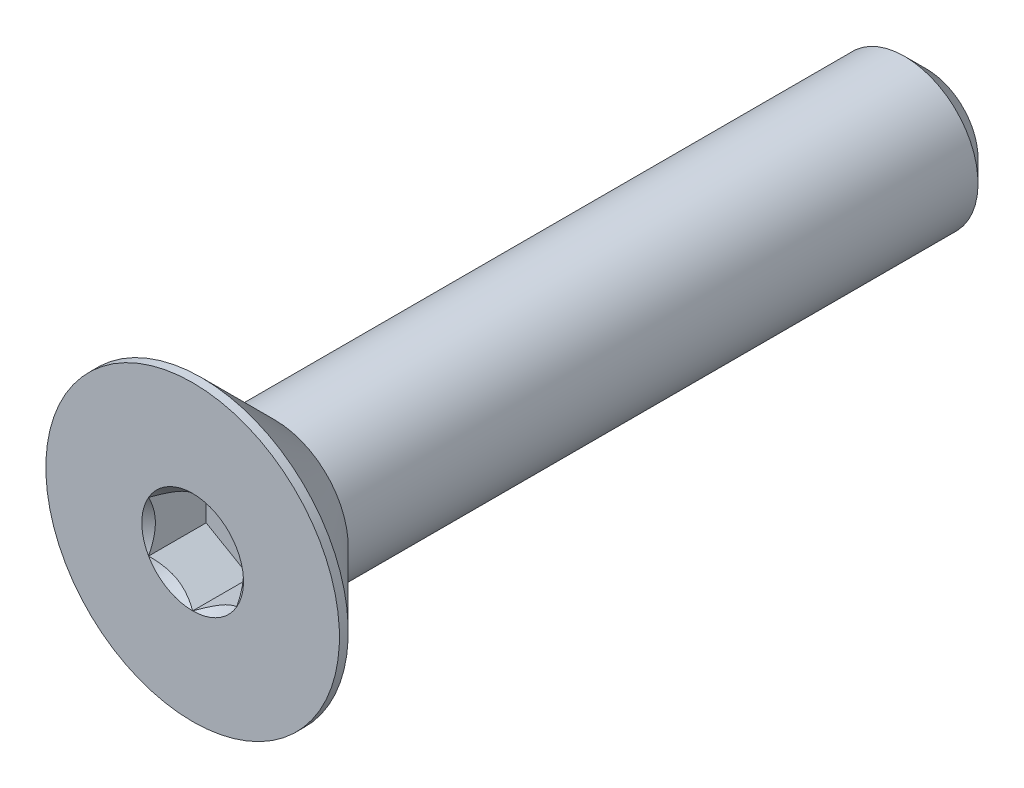
ISO-10303-21;
HEADER;
FILE_DESCRIPTION(('STEP AP214'),'2;1');
FILE_NAME('part.step','',(''),(''),'','','');
FILE_SCHEMA(('AUTOMOTIVE_DESIGN { 1 0 10303 214 1 1 1 1 }'));
ENDSEC;
DATA;
#1=APPLICATION_CONTEXT('core data for automotive mechanical design processes');
#2=APPLICATION_PROTOCOL_DEFINITION('international standard','automotive_design',2000,#1);
#3=PRODUCT_CONTEXT('',#1,'mechanical');
#4=PRODUCT('Part','Part','',(#3));
#5=PRODUCT_RELATED_PRODUCT_CATEGORY('part','',(#4));
#6=PRODUCT_DEFINITION_FORMATION('','',#4);
#7=PRODUCT_DEFINITION_CONTEXT('part definition',#1,'design');
#8=PRODUCT_DEFINITION('design','',#6,#7);
#9=PRODUCT_DEFINITION_SHAPE('','',#8);
#10=(LENGTH_UNIT() NAMED_UNIT(*) SI_UNIT(.MILLI.,.METRE.));
#11=(NAMED_UNIT(*) PLANE_ANGLE_UNIT() SI_UNIT($,.RADIAN.));
#12=(NAMED_UNIT(*) SI_UNIT($,.STERADIAN.) SOLID_ANGLE_UNIT());
#13=UNCERTAINTY_MEASURE_WITH_UNIT(LENGTH_MEASURE(1.E-05),#10,'distance_accuracy_value','');
#14=(GEOMETRIC_REPRESENTATION_CONTEXT(3) GLOBAL_UNCERTAINTY_ASSIGNED_CONTEXT((#13)) GLOBAL_UNIT_ASSIGNED_CONTEXT((#10,
#11,#12)) REPRESENTATION_CONTEXT('',''));
#15=CARTESIAN_POINT('',(0.,0.,0.));
#16=DIRECTION('',(0.,0.,1.));
#17=DIRECTION('',(1.,0.,0.));
#18=AXIS2_PLACEMENT_3D('',#15,#16,#17);
#19=CARTESIAN_POINT('',(0.,0.,-12.5));
#20=DIRECTION('',(0.,0.,-1.));
#21=DIRECTION('',(0.,1.,0.));
#22=AXIS2_PLACEMENT_3D('',#19,#20,#21);
#23=CYLINDRICAL_SURFACE('',#22,2.5);
#24=CARTESIAN_POINT('',(0.,0.,9.7));
#25=DIRECTION('',(0.,0.,-1.));
#26=DIRECTION('',(0.,1.,0.));
#27=AXIS2_PLACEMENT_3D('',#24,#25,#26);
#28=CIRCLE('',#27,2.5);
#29=CARTESIAN_POINT('',(0.,2.5,9.7));
#30=VERTEX_POINT('',#29);
#31=EDGE_CURVE('E11',#30,#30,#28,.F.);
#32=ORIENTED_EDGE('',*,*,#31,.F.);
#33=EDGE_LOOP('',(#32));
#34=FACE_BOUND('',#33,.T.);
#35=CARTESIAN_POINT('',(0.,0.,-11.75));
#36=DIRECTION('',(0.,0.,-1.));
#37=DIRECTION('',(0.,1.,0.));
#38=AXIS2_PLACEMENT_3D('',#35,#36,#37);
#39=CIRCLE('',#38,2.5);
#40=CARTESIAN_POINT('',(0.,2.5,-11.75));
#41=VERTEX_POINT('',#40);
#42=EDGE_CURVE('E48',#41,#41,#39,.F.);
#43=ORIENTED_EDGE('',*,*,#42,.T.);
#44=EDGE_LOOP('',(#43));
#45=FACE_BOUND('',#44,.T.);
#46=ADVANCED_FACE('F39',(#34,#45),#23,.T.);
#47=CARTESIAN_POINT('',(0.,2.5,-12.5));
#48=DIRECTION('',(0.,0.,-1.));
#49=DIRECTION('',(0.,1.,0.));
#50=AXIS2_PLACEMENT_3D('',#47,#48,#49);
#51=PLANE('',#50);
#52=CARTESIAN_POINT('',(0.,0.,-12.5));
#53=DIRECTION('',(0.,0.,-1.));
#54=DIRECTION('',(0.,1.,0.));
#55=AXIS2_PLACEMENT_3D('',#52,#53,#54);
#56=CIRCLE('',#55,1.74999999999999);
#57=CARTESIAN_POINT('',(0.,1.75,-12.5));
#58=VERTEX_POINT('',#57);
#59=EDGE_CURVE('E164',#58,#58,#56,.T.);
#60=ORIENTED_EDGE('',*,*,#59,.T.);
#61=EDGE_LOOP('',(#60));
#62=FACE_BOUND('',#61,.T.);
#63=ADVANCED_FACE('F175',(#62),#51,.T.);
#64=CARTESIAN_POINT('',(0.,0.,-12.5));
#65=DIRECTION('',(0.,0.,1.));
#66=DIRECTION('',(0.,-1.,0.));
#67=AXIS2_PLACEMENT_3D('',#64,#65,#66);
#68=CONICAL_SURFACE('',#67,1.74999999999999,0.785398163397447);
#69=ORIENTED_EDGE('',*,*,#42,.F.);
#70=EDGE_LOOP('',(#69));
#71=FACE_BOUND('',#70,.T.);
#72=ORIENTED_EDGE('',*,*,#59,.F.);
#73=EDGE_LOOP('',(#72));
#74=FACE_BOUND('',#73,.T.);
#75=ADVANCED_FACE('F41',(#71,#74),#68,.T.);
#76=CARTESIAN_POINT('',(0.,0.,-12.5));
#77=DIRECTION('',(0.,0.,-1.));
#78=DIRECTION('',(0.,1.,0.));
#79=AXIS2_PLACEMENT_3D('',#76,#77,#78);
#80=CYLINDRICAL_SURFACE('',#79,5.);
#81=CARTESIAN_POINT('',(0.,0.,12.5));
#82=DIRECTION('',(0.,0.,-1.));
#83=DIRECTION('',(0.,1.,0.));
#84=AXIS2_PLACEMENT_3D('',#81,#82,#83);
#85=CIRCLE('',#84,5.);
#86=CARTESIAN_POINT('',(0.,5.,12.5));
#87=VERTEX_POINT('',#86);
#88=EDGE_CURVE('E139',#87,#87,#85,.T.);
#89=ORIENTED_EDGE('',*,*,#88,.T.);
#90=EDGE_LOOP('',(#89));
#91=FACE_BOUND('',#90,.T.);
#92=CARTESIAN_POINT('',(0.,0.,12.2));
#93=DIRECTION('',(0.,0.,-1.));
#94=DIRECTION('',(0.,1.,0.));
#95=AXIS2_PLACEMENT_3D('',#92,#93,#94);
#96=CIRCLE('',#95,5.);
#97=CARTESIAN_POINT('',(0.,5.,12.2));
#98=VERTEX_POINT('',#97);
#99=EDGE_CURVE('E134',#98,#98,#96,.T.);
#100=ORIENTED_EDGE('',*,*,#99,.F.);
#101=EDGE_LOOP('',(#100));
#102=FACE_BOUND('',#101,.T.);
#103=ADVANCED_FACE('F174',(#91,#102),#80,.T.);
#104=CARTESIAN_POINT('',(0.,0.,9.7));
#105=DIRECTION('',(0.,0.,1.));
#106=DIRECTION('',(0.,-1.,0.));
#107=AXIS2_PLACEMENT_3D('',#104,#105,#106);
#108=CONICAL_SURFACE('',#107,2.5,0.78539816339745);
#109=ORIENTED_EDGE('',*,*,#99,.T.);
#110=EDGE_LOOP('',(#109));
#111=FACE_BOUND('',#110,.T.);
#112=ORIENTED_EDGE('',*,*,#31,.T.);
#113=EDGE_LOOP('',(#112));
#114=FACE_BOUND('',#113,.T.);
#115=ADVANCED_FACE('F188',(#111,#114),#108,.T.);
#116=CARTESIAN_POINT('',(0.,0.,12.5));
#117=DIRECTION('',(0.,0.,1.));
#118=DIRECTION('',(0.,-1.,0.));
#119=AXIS2_PLACEMENT_3D('',#116,#117,#118);
#120=PLANE('',#119);
#121=CARTESIAN_POINT('',(0.,0.,12.5));
#122=DIRECTION('',(0.,0.,1.));
#123=DIRECTION('',(1.,0.,0.));
#124=AXIS2_PLACEMENT_3D('',#121,#122,#123);
#125=CIRCLE('',#124,1.73205080756888);
#126=CARTESIAN_POINT('',(1.5,0.866025403784443,12.5));
#127=VERTEX_POINT('',#126);
#128=CARTESIAN_POINT('',(0.,1.73205080756888,12.5));
#129=VERTEX_POINT('',#128);
#130=EDGE_CURVE('E99',#127,#129,#125,.T.);
#131=ORIENTED_EDGE('',*,*,#130,.F.);
#132=CARTESIAN_POINT('',(0.,0.,12.5));
#133=DIRECTION('',(0.,0.,1.));
#134=DIRECTION('',(1.,0.,0.));
#135=AXIS2_PLACEMENT_3D('',#132,#133,#134);
#136=CIRCLE('',#135,1.73205080756888);
#137=CARTESIAN_POINT('',(1.49999999999999,-0.866025403784446,12.5));
#138=VERTEX_POINT('',#137);
#139=EDGE_CURVE('E112',#138,#127,#136,.T.);
#140=ORIENTED_EDGE('',*,*,#139,.F.);
#141=CARTESIAN_POINT('',(0.,0.,12.5));
#142=DIRECTION('',(0.,0.,1.));
#143=DIRECTION('',(1.,0.,0.));
#144=AXIS2_PLACEMENT_3D('',#141,#142,#143);
#145=CIRCLE('',#144,1.73205080756888);
#146=CARTESIAN_POINT('',(0.,-1.73205080756887,12.5));
#147=VERTEX_POINT('',#146);
#148=EDGE_CURVE('E268',#147,#138,#145,.T.);
#149=ORIENTED_EDGE('',*,*,#148,.F.);
#150=CARTESIAN_POINT('',(0.,0.,12.5));
#151=DIRECTION('',(0.,0.,1.));
#152=DIRECTION('',(1.,0.,0.));
#153=AXIS2_PLACEMENT_3D('',#150,#151,#152);
#154=CIRCLE('',#153,1.73205080756888);
#155=CARTESIAN_POINT('',(-1.5,-0.866025403784427,12.5));
#156=VERTEX_POINT('',#155);
#157=EDGE_CURVE('E128',#156,#147,#154,.T.);
#158=ORIENTED_EDGE('',*,*,#157,.F.);
#159=CARTESIAN_POINT('',(0.,0.,12.5));
#160=DIRECTION('',(0.,0.,1.));
#161=DIRECTION('',(1.,0.,0.));
#162=AXIS2_PLACEMENT_3D('',#159,#160,#161);
#163=CIRCLE('',#162,1.73205080756888);
#164=CARTESIAN_POINT('',(-1.5,0.866025403784438,12.5));
#165=VERTEX_POINT('',#164);
#166=EDGE_CURVE('E269',#165,#156,#163,.T.);
#167=ORIENTED_EDGE('',*,*,#166,.F.);
#168=CARTESIAN_POINT('',(0.,0.,12.5));
#169=DIRECTION('',(0.,0.,1.));
#170=DIRECTION('',(1.,0.,0.));
#171=AXIS2_PLACEMENT_3D('',#168,#169,#170);
#172=CIRCLE('',#171,1.73205080756888);
#173=EDGE_CURVE('E115',#129,#165,#172,.T.);
#174=ORIENTED_EDGE('',*,*,#173,.F.);
#175=EDGE_LOOP('',(#131,#140,#149,#158,#167,#174));
#176=FACE_BOUND('',#175,.T.);
#177=ORIENTED_EDGE('',*,*,#88,.F.);
#178=EDGE_LOOP('',(#177));
#179=FACE_BOUND('',#178,.T.);
#180=ADVANCED_FACE('F109',(#176,#179),#120,.T.);
#181=CARTESIAN_POINT('',(1.5,0.86602540378444,10.54));
#182=DIRECTION('',(0.5,0.866025403784438,0.));
#183=DIRECTION('',(-0.866025403784439,0.5,0.));
#184=AXIS2_PLACEMENT_3D('',#181,#182,#183);
#185=PLANE('',#184);
#186=DIRECTION('',(0.,0.,1.));
#187=VECTOR('',#186,1.);
#188=CARTESIAN_POINT('',(1.5,0.86602540378444,10.54));
#189=LINE('',#188,#187);
#190=CARTESIAN_POINT('',(1.5,0.86602540378444,10.54));
#191=VERTEX_POINT('',#190);
#192=EDGE_CURVE('E55',#191,#127,#189,.T.);
#193=ORIENTED_EDGE('',*,*,#192,.T.);
#194=CARTESIAN_POINT('',(-0.000200000000000019,1.73216627762272,12.5001154816001));
#195=CARTESIAN_POINT('',(0.0513677907370754,1.70239359975915,12.4703654760673));
#196=CARTESIAN_POINT('',(0.1037979176652,1.67212305186355,12.4423624839103));
#197=CARTESIAN_POINT('',(0.210709034055596,1.61039789003619,12.3910892304401));
#198=CARTESIAN_POINT('',(0.26520019581466,1.57893740312614,12.3678475050444));
#199=CARTESIAN_POINT('',(0.375079081357247,1.51549879897987,12.3280337289922));
#200=CARTESIAN_POINT('',(0.430438809095198,1.4835368452681,12.3113615856709));
#201=CARTESIAN_POINT('',(0.542377257477149,1.41890915196211,12.2856744568181));
#202=CARTESIAN_POINT('',(0.598952556553007,1.38624538781118,12.2766402904789));
#203=CARTESIAN_POINT('',(0.696455389516439,1.329952100953,12.2684890812268));
#204=CARTESIAN_POINT('',(0.737256908280464,1.30639533311124,12.2672822529892));
#205=CARTESIAN_POINT('',(0.818787969615856,1.25932335290194,12.2693140571623));
#206=CARTESIAN_POINT('',(0.859517494314628,1.23580815085314,12.2725536707483));
#207=CARTESIAN_POINT('',(0.940584402163413,1.18900414978427,12.283291985982));
#208=CARTESIAN_POINT('',(0.980921384598285,1.1657155821172,12.2907946530187));
#209=CARTESIAN_POINT('',(1.06091833691403,1.11952932016335,12.3096516119283));
#210=CARTESIAN_POINT('',(1.1005780085162,1.09663179808787,12.3210075570186));
#211=CARTESIAN_POINT('',(1.20216313477448,1.03798159809699,12.3547216475927));
#212=CARTESIAN_POINT('',(1.26345855370969,1.00259267147466,12.3796218490934));
#213=CARTESIAN_POINT('',(1.35358562846331,0.950557780604376,12.4216566532716));
#214=CARTESIAN_POINT('',(1.38328513990772,0.933410759677149,12.4364251535591));
#215=CARTESIAN_POINT('',(1.44213790138375,0.899432101996408,12.4673105659402));
#216=CARTESIAN_POINT('',(1.47129140422064,0.882600319285711,12.4834268341217));
#217=CARTESIAN_POINT('',(1.5002,0.865909933730602,12.5001154816001));
#218=B_SPLINE_CURVE_WITH_KNOTS('',3,(#194,#195,#196,#197,#198,#199,#200,#201,#202,#203,#204,
#205,#206,#207,#208,#209,#210,#211,#212,#213,#214,#215,#216,#217),.UNSPECIFIED.,.F.,.F.,(4,2,2,
2,2,2,2,2,2,2,2,4),(0.,0.199829143693304,0.400822987382387,0.598623720538179,0.795926240188887,
0.937113067959879,1.07833105577193,1.21968061668221,1.36109089931054,1.58570969637565,
1.69770705470963,1.80965120737194),.UNSPECIFIED.);
#219=EDGE_CURVE('E96',#129,#127,#218,.T.);
#220=ORIENTED_EDGE('',*,*,#219,.F.);
#221=DIRECTION('',(0.,0.,1.));
#222=VECTOR('',#221,1.);
#223=CARTESIAN_POINT('',(0.,1.73205080756888,10.54));
#224=LINE('',#223,#222);
#225=CARTESIAN_POINT('',(0.,1.73205080756888,10.54));
#226=VERTEX_POINT('',#225);
#227=EDGE_CURVE('E158',#226,#129,#224,.T.);
#228=ORIENTED_EDGE('',*,*,#227,.F.);
#229=DIRECTION('',(-0.866025403784439,0.5,0.));
#230=VECTOR('',#229,1.);
#231=CARTESIAN_POINT('',(1.5,0.86602540378444,10.54));
#232=LINE('',#231,#230);
#233=EDGE_CURVE('E124',#191,#226,#232,.T.);
#234=ORIENTED_EDGE('',*,*,#233,.F.);
#235=EDGE_LOOP('',(#193,#220,#228,#234));
#236=FACE_BOUND('',#235,.T.);
#237=ADVANCED_FACE('F130',(#236),#185,.F.);
#238=CARTESIAN_POINT('',(1.5,-0.86602540378444,10.54));
#239=DIRECTION('',(1.,0.,0.));
#240=DIRECTION('',(0.,0.,-1.));
#241=AXIS2_PLACEMENT_3D('',#238,#239,#240);
#242=PLANE('',#241);
#243=DIRECTION('',(0.,0.,1.));
#244=VECTOR('',#243,1.);
#245=CARTESIAN_POINT('',(1.5,-0.86602540378444,10.54));
#246=LINE('',#245,#244);
#247=CARTESIAN_POINT('',(1.5,-0.86602540378444,10.54));
#248=VERTEX_POINT('',#247);
#249=EDGE_CURVE('E63',#248,#138,#246,.T.);
#250=ORIENTED_EDGE('',*,*,#249,.T.);
#251=CARTESIAN_POINT('',(1.5,-1.72720812969693,13.0555785162708));
#252=CARTESIAN_POINT('',(1.5,-1.68515175699268,13.0238299078574));
#253=CARTESIAN_POINT('',(1.5,-1.64286104748674,12.9923925938074));
#254=CARTESIAN_POINT('',(1.5,-1.55771581035942,12.9302690875564));
#255=CARTESIAN_POINT('',(1.5,-1.51486114386669,12.8995830858922));
#256=CARTESIAN_POINT('',(1.5,-1.38468134151271,12.8084071924272));
#257=CARTESIAN_POINT('',(1.5,-1.29637976071654,12.7492883434268));
#258=CARTESIAN_POINT('',(1.5,-1.11121478730467,12.6332309963165));
#259=CARTESIAN_POINT('',(1.5,-1.01415038238167,12.576609558733));
#260=CARTESIAN_POINT('',(1.5,-0.815173408897605,12.4730368812657));
#261=CARTESIAN_POINT('',(1.5,-0.713278669253284,12.4260530415417));
#262=CARTESIAN_POINT('',(1.5,-0.56033377494311,12.3685726684308));
#263=CARTESIAN_POINT('',(1.5,-0.51154798294804,12.3520753877573));
#264=CARTESIAN_POINT('',(1.5,-0.412798620136865,12.322997512927));
#265=CARTESIAN_POINT('',(1.5,-0.362834968437561,12.310417188594));
#266=CARTESIAN_POINT('',(1.5,-0.26286323544498,12.2900361941468));
#267=CARTESIAN_POINT('',(1.5,-0.21287211380802,12.282153632746));
#268=CARTESIAN_POINT('',(1.5,-0.112355243569542,12.271322063969));
#269=CARTESIAN_POINT('',(1.5,-0.0618295883726245,12.2683722085244));
#270=CARTESIAN_POINT('',(1.5,0.037429173332388,12.2676248577249));
#271=CARTESIAN_POINT('',(1.5,0.086160967200303,12.2696447335581));
#272=CARTESIAN_POINT('',(1.5,0.183206937768831,12.2783225528968));
#273=CARTESIAN_POINT('',(1.5,0.231521073438273,12.2849809469685));
#274=CARTESIAN_POINT('',(1.5,0.32819985342544,12.3026852441226));
#275=CARTESIAN_POINT('',(1.5,0.376550616310333,12.313805811257));
#276=CARTESIAN_POINT('',(1.5,0.472195697125603,12.3398434140487));
#277=CARTESIAN_POINT('',(1.5,0.519490103092746,12.3547601320409));
#278=CARTESIAN_POINT('',(1.5,0.66839128269663,12.4073352235961));
#279=CARTESIAN_POINT('',(1.5,0.767878709508558,12.450981287472));
#280=CARTESIAN_POINT('',(1.5,0.962179866690728,12.5480229945931));
#281=CARTESIAN_POINT('',(1.5,1.05697519961444,12.6014536650895));
#282=CARTESIAN_POINT('',(1.5,1.23814273533383,12.7116858520046));
#283=CARTESIAN_POINT('',(1.5,1.3246994218129,12.7681879206986));
#284=CARTESIAN_POINT('',(1.5,1.45222331290674,12.8555343015787));
#285=CARTESIAN_POINT('',(1.5,1.49418091978756,12.88495775868));
#286=CARTESIAN_POINT('',(1.5,1.57752272931477,12.9445828218305));
#287=CARTESIAN_POINT('',(1.5,1.61890708647355,12.9747842116644));
#288=CARTESIAN_POINT('',(1.5,1.66005278019494,13.0053081786095));
#289=B_SPLINE_CURVE_WITH_KNOTS('',3,(#251,#252,#253,#254,#255,#256,#257,#258,#259,#260,#261,
#262,#263,#264,#265,#266,#267,#268,#269,#270,#271,#272,#273,#274,#275,#276,#277,#278,#279,#280,
#281,#282,#283,#284,#285,#286,#287,#288),.UNSPECIFIED.,.F.,.F.,(4,2,2,2,2,2,2,2,2,2,2,2,2,2,2,2,
2,2,4),(0.,0.15807954898267,0.316198780993945,0.634850417346964,0.971690311361518,
1.30737131660668,1.4617396112709,1.61611853740678,1.76772101421411,1.9192974236854,
2.06538741209602,2.21149159305546,2.36014984633874,2.50879566386711,2.83376031422675,
3.15991186985653,3.46985601802199,3.62358896039975,3.77727962642072),.UNSPECIFIED.);
#290=EDGE_CURVE('E122',#127,#138,#289,.F.);
#291=ORIENTED_EDGE('',*,*,#290,.F.);
#292=ORIENTED_EDGE('',*,*,#192,.F.);
#293=DIRECTION('',(0.,1.,0.));
#294=VECTOR('',#293,1.);
#295=CARTESIAN_POINT('',(1.5,-0.86602540378444,10.54));
#296=LINE('',#295,#294);
#297=EDGE_CURVE('E144',#248,#191,#296,.T.);
#298=ORIENTED_EDGE('',*,*,#297,.F.);
#299=EDGE_LOOP('',(#250,#291,#292,#298));
#300=FACE_BOUND('',#299,.T.);
#301=ADVANCED_FACE('F126',(#300),#242,.F.);
#302=CARTESIAN_POINT('',(0.,-1.73205080756888,10.54));
#303=DIRECTION('',(0.5,-0.866025403784439,0.));
#304=DIRECTION('',(0.866025403784439,0.5,0.));
#305=AXIS2_PLACEMENT_3D('',#302,#303,#304);
#306=PLANE('',#305);
#307=DIRECTION('',(0.,0.,1.));
#308=VECTOR('',#307,1.);
#309=CARTESIAN_POINT('',(0.,-1.73205080756888,10.54));
#310=LINE('',#309,#308);
#311=CARTESIAN_POINT('',(0.,-1.73205080756888,10.54));
#312=VERTEX_POINT('',#311);
#313=EDGE_CURVE('E141',#312,#147,#310,.T.);
#314=ORIENTED_EDGE('',*,*,#313,.T.);
#315=CARTESIAN_POINT('',(1.5002,-0.865909933730602,12.5001154816001));
#316=CARTESIAN_POINT('',(1.44863220926292,-0.895682611594166,12.4703654760673));
#317=CARTESIAN_POINT('',(1.3962020823348,-0.925953159489766,12.4423624839103));
#318=CARTESIAN_POINT('',(1.2892909659444,-0.987678321317124,12.3910892304402));
#319=CARTESIAN_POINT('',(1.23479980418534,-1.01913880822718,12.3678475050444));
#320=CARTESIAN_POINT('',(1.12492091864275,-1.08257741237344,12.3280337289922));
#321=CARTESIAN_POINT('',(1.0695611909048,-1.11453936608521,12.3113615856709));
#322=CARTESIAN_POINT('',(0.957622742522851,-1.1791670593912,12.2856744568181));
#323=CARTESIAN_POINT('',(0.901047443446993,-1.21183082354213,12.2766402904789));
#324=CARTESIAN_POINT('',(0.80354461048356,-1.26812411040032,12.2684890812269));
#325=CARTESIAN_POINT('',(0.762743091719535,-1.29168087824208,12.2672822529892));
#326=CARTESIAN_POINT('',(0.681212030384142,-1.33875285845138,12.2693140571623));
#327=CARTESIAN_POINT('',(0.64048250568537,-1.36226806050018,12.2725536707483));
#328=CARTESIAN_POINT('',(0.559415597836584,-1.40907206156905,12.283291985982));
#329=CARTESIAN_POINT('',(0.519078615401712,-1.43236062923612,12.2907946530187));
#330=CARTESIAN_POINT('',(0.439081663085969,-1.47854689118997,12.3096516119283));
#331=CARTESIAN_POINT('',(0.399421991483791,-1.50144441326545,12.3210075570186));
#332=CARTESIAN_POINT('',(0.297836865225514,-1.56009461325633,12.3547216475927));
#333=CARTESIAN_POINT('',(0.23654144629031,-1.59548353987866,12.3796218490934));
#334=CARTESIAN_POINT('',(0.146414371536686,-1.64751843074894,12.4216566532716));
#335=CARTESIAN_POINT('',(0.116714860092281,-1.66466545167617,12.4364251535591));
#336=CARTESIAN_POINT('',(0.0578620986162486,-1.69864410935691,12.4673105659402));
#337=CARTESIAN_POINT('',(0.0287085957793626,-1.71547589206761,12.4834268341217));
#338=CARTESIAN_POINT('',(-0.00019999999999992,-1.73216627762272,12.5001154816001));
#339=B_SPLINE_CURVE_WITH_KNOTS('',3,(#315,#316,#317,#318,#319,#320,#321,#322,#323,#324,#325,
#326,#327,#328,#329,#330,#331,#332,#333,#334,#335,#336,#337,#338),.UNSPECIFIED.,.F.,.F.,(4,2,2,
2,2,2,2,2,2,2,2,4),(0.,0.199829143693304,0.400822987382387,0.598623720538178,0.795926240188886,
0.937113067959879,1.07833105577193,1.21968061668222,1.36109089931054,1.58570969637565,
1.69770705470964,1.80965120737193),.UNSPECIFIED.);
#340=EDGE_CURVE('E265',#138,#147,#339,.T.);
#341=ORIENTED_EDGE('',*,*,#340,.F.);
#342=ORIENTED_EDGE('',*,*,#249,.F.);
#343=DIRECTION('',(0.866025403784439,0.5,0.));
#344=VECTOR('',#343,1.);
#345=CARTESIAN_POINT('',(0.,-1.73205080756888,10.54));
#346=LINE('',#345,#344);
#347=EDGE_CURVE('E255',#312,#248,#346,.T.);
#348=ORIENTED_EDGE('',*,*,#347,.F.);
#349=EDGE_LOOP('',(#314,#341,#342,#348));
#350=FACE_BOUND('',#349,.T.);
#351=ADVANCED_FACE('F213',(#350),#306,.F.);
#352=CARTESIAN_POINT('',(-1.5,-0.866025403784439,10.54));
#353=DIRECTION('',(-0.5,-0.866025403784438,0.));
#354=DIRECTION('',(0.866025403784439,-0.5,0.));
#355=AXIS2_PLACEMENT_3D('',#352,#353,#354);
#356=PLANE('',#355);
#357=DIRECTION('',(0.,0.,1.));
#358=VECTOR('',#357,1.);
#359=CARTESIAN_POINT('',(-1.5,-0.866025403784439,10.54));
#360=LINE('',#359,#358);
#361=CARTESIAN_POINT('',(-1.5,-0.866025403784439,10.54));
#362=VERTEX_POINT('',#361);
#363=EDGE_CURVE('E150',#362,#156,#360,.T.);
#364=ORIENTED_EDGE('',*,*,#363,.T.);
#365=CARTESIAN_POINT('',(0.000199999999999358,-1.73216627762272,12.5001154816001));
#366=CARTESIAN_POINT('',(-0.0513677907370768,-1.70239359975915,12.4703654760673));
#367=CARTESIAN_POINT('',(-0.103797917665202,-1.67212305186355,12.4423624839103));
#368=CARTESIAN_POINT('',(-0.210709034055599,-1.61039789003619,12.3910892304402));
#369=CARTESIAN_POINT('',(-0.265200195814663,-1.57893740312614,12.3678475050444));
#370=CARTESIAN_POINT('',(-0.375079081357251,-1.51549879897987,12.3280337289922));
#371=CARTESIAN_POINT('',(-0.430438809095202,-1.4835368452681,12.3113615856709));
#372=CARTESIAN_POINT('',(-0.542377257477154,-1.41890915196211,12.2856744568181));
#373=CARTESIAN_POINT('',(-0.598952556553012,-1.38624538781118,12.2766402904789));
#374=CARTESIAN_POINT('',(-0.696455389516445,-1.32995210095299,12.2684890812269));
#375=CARTESIAN_POINT('',(-0.73725690828047,-1.30639533311124,12.2672822529892));
#376=CARTESIAN_POINT('',(-0.818787969615863,-1.25932335290193,12.2693140571623));
#377=CARTESIAN_POINT('',(-0.859517494314635,-1.23580815085313,12.2725536707483));
#378=CARTESIAN_POINT('',(-0.940584402163421,-1.18900414978426,12.283291985982));
#379=CARTESIAN_POINT('',(-0.980921384598293,-1.16571558211719,12.2907946530187));
#380=CARTESIAN_POINT('',(-1.06091833691404,-1.11952932016335,12.3096516119283));
#381=CARTESIAN_POINT('',(-1.10057800851621,-1.09663179808786,12.3210075570186));
#382=CARTESIAN_POINT('',(-1.20216313477449,-1.03798159809698,12.3547216475927));
#383=CARTESIAN_POINT('',(-1.26345855370969,-1.00259267147465,12.3796218490934));
#384=CARTESIAN_POINT('',(-1.35358562846332,-0.950557780604373,12.4216566532716));
#385=CARTESIAN_POINT('',(-1.38328513990772,-0.933410759677146,12.4364251535591));
#386=CARTESIAN_POINT('',(-1.44213790138375,-0.899432101996406,12.4673105659402));
#387=CARTESIAN_POINT('',(-1.47129140422064,-0.882600319285709,12.4834268341217));
#388=CARTESIAN_POINT('',(-1.5002,-0.865909933730601,12.5001154816001));
#389=B_SPLINE_CURVE_WITH_KNOTS('',3,(#365,#366,#367,#368,#369,#370,#371,#372,#373,#374,#375,
#376,#377,#378,#379,#380,#381,#382,#383,#384,#385,#386,#387,#388),.UNSPECIFIED.,.F.,.F.,(4,2,2,
2,2,2,2,2,2,2,2,4),(0.,0.199829143693306,0.40082298738239,0.598623720538184,0.795926240188893,
0.937113067959886,1.07833105577193,1.21968061668222,1.36109089931055,1.58570969637566,
1.69770705470964,1.80965120737194),.UNSPECIFIED.);
#390=EDGE_CURVE('E231',#147,#156,#389,.T.);
#391=ORIENTED_EDGE('',*,*,#390,.F.);
#392=ORIENTED_EDGE('',*,*,#313,.F.);
#393=DIRECTION('',(0.866025403784438,-0.5,0.));
#394=VECTOR('',#393,1.);
#395=CARTESIAN_POINT('',(-1.5,-0.866025403784439,10.54));
#396=LINE('',#395,#394);
#397=EDGE_CURVE('E252',#362,#312,#396,.T.);
#398=ORIENTED_EDGE('',*,*,#397,.F.);
#399=EDGE_LOOP('',(#364,#391,#392,#398));
#400=FACE_BOUND('',#399,.T.);
#401=ADVANCED_FACE('F209',(#400),#356,.F.);
#402=CARTESIAN_POINT('',(-1.5,0.866025403784439,10.54));
#403=DIRECTION('',(-1.,0.,0.));
#404=DIRECTION('',(0.,-1.,0.));
#405=AXIS2_PLACEMENT_3D('',#402,#403,#404);
#406=PLANE('',#405);
#407=DIRECTION('',(0.,0.,1.));
#408=VECTOR('',#407,1.);
#409=CARTESIAN_POINT('',(-1.5,0.866025403784439,10.54));
#410=LINE('',#409,#408);
#411=CARTESIAN_POINT('',(-1.5,0.866025403784439,10.54));
#412=VERTEX_POINT('',#411);
#413=EDGE_CURVE('E154',#412,#165,#410,.T.);
#414=ORIENTED_EDGE('',*,*,#413,.T.);
#415=CARTESIAN_POINT('',(-1.5,-1.72720812969693,13.0555785162708));
#416=CARTESIAN_POINT('',(-1.5,-1.68515175699268,13.0238299078574));
#417=CARTESIAN_POINT('',(-1.5,-1.64286104748674,12.9923925938074));
#418=CARTESIAN_POINT('',(-1.5,-1.55771581035942,12.9302690875564));
#419=CARTESIAN_POINT('',(-1.5,-1.51486114386668,12.8995830858922));
#420=CARTESIAN_POINT('',(-1.5,-1.3846813415127,12.8084071924272));
#421=CARTESIAN_POINT('',(-1.5,-1.29637976071654,12.7492883434268));
#422=CARTESIAN_POINT('',(-1.5,-1.11121478730467,12.6332309963165));
#423=CARTESIAN_POINT('',(-1.5,-1.01415038238167,12.576609558733));
#424=CARTESIAN_POINT('',(-1.5,-0.815173408897605,12.4730368812657));
#425=CARTESIAN_POINT('',(-1.5,-0.713278669253284,12.4260530415417));
#426=CARTESIAN_POINT('',(-1.5,-0.56033377494311,12.3685726684308));
#427=CARTESIAN_POINT('',(-1.5,-0.51154798294804,12.3520753877573));
#428=CARTESIAN_POINT('',(-1.5,-0.412798620136864,12.322997512927));
#429=CARTESIAN_POINT('',(-1.5,-0.36283496843756,12.310417188594));
#430=CARTESIAN_POINT('',(-1.5,-0.262863235444978,12.2900361941468));
#431=CARTESIAN_POINT('',(-1.5,-0.212872113808019,12.282153632746));
#432=CARTESIAN_POINT('',(-1.5,-0.112355243569541,12.271322063969));
#433=CARTESIAN_POINT('',(-1.5,-0.0618295883726232,12.2683722085244));
#434=CARTESIAN_POINT('',(-1.5,0.0374291733323892,12.2676248577249));
#435=CARTESIAN_POINT('',(-1.5,0.0861609672003043,12.2696447335581));
#436=CARTESIAN_POINT('',(-1.5,0.183206937768832,12.2783225528968));
#437=CARTESIAN_POINT('',(-1.5,0.231521073438275,12.2849809469685));
#438=CARTESIAN_POINT('',(-1.5,0.328199853425442,12.3026852441226));
#439=CARTESIAN_POINT('',(-1.5,0.376550616310334,12.313805811257));
#440=CARTESIAN_POINT('',(-1.5,0.472195697125604,12.3398434140487));
#441=CARTESIAN_POINT('',(-1.5,0.519490103092746,12.3547601320409));
#442=CARTESIAN_POINT('',(-1.5,0.66839128269663,12.4073352235961));
#443=CARTESIAN_POINT('',(-1.5,0.767878709508559,12.450981287472));
#444=CARTESIAN_POINT('',(-1.5,0.96217986669073,12.5480229945931));
#445=CARTESIAN_POINT('',(-1.5,1.05697519961444,12.6014536650895));
#446=CARTESIAN_POINT('',(-1.5,1.23814273533383,12.7116858520046));
#447=CARTESIAN_POINT('',(-1.5,1.3246994218129,12.7681879206986));
#448=CARTESIAN_POINT('',(-1.5,1.45222331290674,12.8555343015787));
#449=CARTESIAN_POINT('',(-1.5,1.49418091978756,12.88495775868));
#450=CARTESIAN_POINT('',(-1.5,1.57752272931477,12.9445828218305));
#451=CARTESIAN_POINT('',(-1.5,1.61890708647354,12.9747842116644));
#452=CARTESIAN_POINT('',(-1.5,1.66005278019494,13.0053081786095));
#453=B_SPLINE_CURVE_WITH_KNOTS('',3,(#415,#416,#417,#418,#419,#420,#421,#422,#423,#424,#425,
#426,#427,#428,#429,#430,#431,#432,#433,#434,#435,#436,#437,#438,#439,#440,#441,#442,#443,#444,
#445,#446,#447,#448,#449,#450,#451,#452),.UNSPECIFIED.,.F.,.F.,(4,2,2,2,2,2,2,2,2,2,2,2,2,2,2,2,
2,2,4),(0.,0.158079548982669,0.316198780993943,0.634850417346962,0.971690311361516,
1.30737131660668,1.46173961127089,1.61611853740678,1.76772101421411,1.91929742368539,
2.06538741209601,2.21149159305545,2.36014984633873,2.50879566386711,2.83376031422674,
3.15991186985653,3.46985601802198,3.62358896039974,3.77727962642071),.UNSPECIFIED.);
#454=EDGE_CURVE('E103',#156,#165,#453,.T.);
#455=ORIENTED_EDGE('',*,*,#454,.F.);
#456=ORIENTED_EDGE('',*,*,#363,.F.);
#457=DIRECTION('',(0.,-1.,0.));
#458=VECTOR('',#457,1.);
#459=CARTESIAN_POINT('',(-1.5,0.866025403784439,10.54));
#460=LINE('',#459,#458);
#461=EDGE_CURVE('E248',#412,#362,#460,.T.);
#462=ORIENTED_EDGE('',*,*,#461,.F.);
#463=EDGE_LOOP('',(#414,#455,#456,#462));
#464=FACE_BOUND('',#463,.T.);
#465=ADVANCED_FACE('F205',(#464),#406,.F.);
#466=CARTESIAN_POINT('',(0.,1.73205080756888,10.54));
#467=DIRECTION('',(-0.5,0.866025403784439,0.));
#468=DIRECTION('',(-0.866025403784439,-0.5,0.));
#469=AXIS2_PLACEMENT_3D('',#466,#467,#468);
#470=PLANE('',#469);
#471=ORIENTED_EDGE('',*,*,#227,.T.);
#472=CARTESIAN_POINT('',(-1.5002,0.865909933730601,12.5001154816001));
#473=CARTESIAN_POINT('',(-1.44863220926292,0.895682611594166,12.4703654760673));
#474=CARTESIAN_POINT('',(-1.3962020823348,0.925953159489766,12.4423624839103));
#475=CARTESIAN_POINT('',(-1.2892909659444,0.987678321317124,12.3910892304401));
#476=CARTESIAN_POINT('',(-1.23479980418534,1.01913880822718,12.3678475050444));
#477=CARTESIAN_POINT('',(-1.12492091864275,1.08257741237345,12.3280337289922));
#478=CARTESIAN_POINT('',(-1.0695611909048,1.11453936608522,12.3113615856709));
#479=CARTESIAN_POINT('',(-0.957622742522848,1.1791670593912,12.2856744568181));
#480=CARTESIAN_POINT('',(-0.901047443446989,1.21183082354213,12.2766402904789));
#481=CARTESIAN_POINT('',(-0.803544610483557,1.26812411040032,12.2684890812268));
#482=CARTESIAN_POINT('',(-0.762743091719532,1.29168087824208,12.2672822529892));
#483=CARTESIAN_POINT('',(-0.68121203038414,1.33875285845138,12.2693140571623));
#484=CARTESIAN_POINT('',(-0.640482505685368,1.36226806050018,12.2725536707483));
#485=CARTESIAN_POINT('',(-0.559415597836582,1.40907206156905,12.283291985982));
#486=CARTESIAN_POINT('',(-0.51907861540171,1.43236062923612,12.2907946530187));
#487=CARTESIAN_POINT('',(-0.439081663085968,1.47854689118997,12.3096516119283));
#488=CARTESIAN_POINT('',(-0.399421991483791,1.50144441326545,12.3210075570186));
#489=CARTESIAN_POINT('',(-0.297836865225514,1.56009461325633,12.3547216475927));
#490=CARTESIAN_POINT('',(-0.23654144629031,1.59548353987866,12.3796218490934));
#491=CARTESIAN_POINT('',(-0.146414371536686,1.64751843074894,12.4216566532716));
#492=CARTESIAN_POINT('',(-0.116714860092282,1.66466545167617,12.4364251535591));
#493=CARTESIAN_POINT('',(-0.0578620986162491,1.69864410935691,12.4673105659402));
#494=CARTESIAN_POINT('',(-0.0287085957793625,1.71547589206761,12.4834268341217));
#495=CARTESIAN_POINT('',(0.000200000000000425,1.73216627762272,12.5001154816001));
#496=B_SPLINE_CURVE_WITH_KNOTS('',3,(#472,#473,#474,#475,#476,#477,#478,#479,#480,#481,#482,
#483,#484,#485,#486,#487,#488,#489,#490,#491,#492,#493,#494,#495),.UNSPECIFIED.,.F.,.F.,(4,2,2,
2,2,2,2,2,2,2,2,4),(0.,0.199829143693306,0.400822987382391,0.598623720538184,0.795926240188893,
0.937113067959885,1.07833105577193,1.21968061668222,1.36109089931055,1.58570969637566,
1.69770705470964,1.80965120737194),.UNSPECIFIED.);
#497=EDGE_CURVE('E261',#165,#129,#496,.T.);
#498=ORIENTED_EDGE('',*,*,#497,.F.);
#499=ORIENTED_EDGE('',*,*,#413,.F.);
#500=DIRECTION('',(-0.866025403784439,-0.5,0.));
#501=VECTOR('',#500,1.);
#502=CARTESIAN_POINT('',(0.,1.73205080756888,10.54));
#503=LINE('',#502,#501);
#504=EDGE_CURVE('E244',#226,#412,#503,.T.);
#505=ORIENTED_EDGE('',*,*,#504,.F.);
#506=EDGE_LOOP('',(#471,#498,#499,#505));
#507=FACE_BOUND('',#506,.T.);
#508=ADVANCED_FACE('F201',(#507),#470,.F.);
#509=CARTESIAN_POINT('',(0.,0.,10.54));
#510=DIRECTION('',(0.,0.,1.));
#511=DIRECTION('',(1.,0.,0.));
#512=AXIS2_PLACEMENT_3D('',#509,#510,#511);
#513=PLANE('',#512);
#514=ORIENTED_EDGE('',*,*,#233,.T.);
#515=ORIENTED_EDGE('',*,*,#504,.T.);
#516=ORIENTED_EDGE('',*,*,#461,.T.);
#517=ORIENTED_EDGE('',*,*,#397,.T.);
#518=ORIENTED_EDGE('',*,*,#347,.T.);
#519=ORIENTED_EDGE('',*,*,#297,.T.);
#520=EDGE_LOOP('',(#514,#515,#516,#517,#518,#519));
#521=FACE_BOUND('',#520,.T.);
#522=ADVANCED_FACE('F204',(#521),#513,.T.);
#523=CARTESIAN_POINT('',(0.,0.,12.5));
#524=DIRECTION('',(0.,0.,1.));
#525=DIRECTION('',(1.,0.,0.));
#526=AXIS2_PLACEMENT_3D('',#523,#524,#525);
#527=CONICAL_SURFACE('',#526,1.73205080756888,0.78539816339745);
#528=ORIENTED_EDGE('',*,*,#497,.T.);
#529=ORIENTED_EDGE('',*,*,#173,.T.);
#530=EDGE_LOOP('',(#528,#529));
#531=FACE_BOUND('',#530,.T.);
#532=ADVANCED_FACE('F221',(#531),#527,.F.);
#533=CARTESIAN_POINT('',(0.,0.,12.5));
#534=DIRECTION('',(0.,0.,1.));
#535=DIRECTION('',(1.,0.,0.));
#536=AXIS2_PLACEMENT_3D('',#533,#534,#535);
#537=CONICAL_SURFACE('',#536,1.73205080756888,0.78539816339745);
#538=ORIENTED_EDGE('',*,*,#390,.T.);
#539=ORIENTED_EDGE('',*,*,#157,.T.);
#540=EDGE_LOOP('',(#538,#539));
#541=FACE_BOUND('',#540,.T.);
#542=ADVANCED_FACE('F223',(#541),#537,.F.);
#543=CARTESIAN_POINT('',(0.,0.,12.5));
#544=DIRECTION('',(0.,0.,1.));
#545=DIRECTION('',(1.,0.,0.));
#546=AXIS2_PLACEMENT_3D('',#543,#544,#545);
#547=CONICAL_SURFACE('',#546,1.73205080756888,0.78539816339745);
#548=ORIENTED_EDGE('',*,*,#290,.T.);
#549=ORIENTED_EDGE('',*,*,#139,.T.);
#550=EDGE_LOOP('',(#548,#549));
#551=FACE_BOUND('',#550,.T.);
#552=ADVANCED_FACE('F121',(#551),#547,.F.);
#553=CARTESIAN_POINT('',(0.,0.,12.5));
#554=DIRECTION('',(0.,0.,1.));
#555=DIRECTION('',(1.,0.,0.));
#556=AXIS2_PLACEMENT_3D('',#553,#554,#555);
#557=CONICAL_SURFACE('',#556,1.73205080756888,0.78539816339745);
#558=ORIENTED_EDGE('',*,*,#340,.T.);
#559=ORIENTED_EDGE('',*,*,#148,.T.);
#560=EDGE_LOOP('',(#558,#559));
#561=FACE_BOUND('',#560,.T.);
#562=ADVANCED_FACE('F283',(#561),#557,.F.);
#563=CARTESIAN_POINT('',(0.,0.,12.5));
#564=DIRECTION('',(0.,0.,1.));
#565=DIRECTION('',(1.,0.,0.));
#566=AXIS2_PLACEMENT_3D('',#563,#564,#565);
#567=CONICAL_SURFACE('',#566,1.73205080756888,0.78539816339745);
#568=ORIENTED_EDGE('',*,*,#454,.T.);
#569=ORIENTED_EDGE('',*,*,#166,.T.);
#570=EDGE_LOOP('',(#568,#569));
#571=FACE_BOUND('',#570,.T.);
#572=ADVANCED_FACE('F288',(#571),#567,.F.);
#573=CARTESIAN_POINT('',(0.,0.,12.5));
#574=DIRECTION('',(0.,0.,1.));
#575=DIRECTION('',(1.,0.,0.));
#576=AXIS2_PLACEMENT_3D('',#573,#574,#575);
#577=CONICAL_SURFACE('',#576,1.73205080756888,0.78539816339745);
#578=ORIENTED_EDGE('',*,*,#219,.T.);
#579=ORIENTED_EDGE('',*,*,#130,.T.);
#580=EDGE_LOOP('',(#578,#579));
#581=FACE_BOUND('',#580,.T.);
#582=ADVANCED_FACE('F98',(#581),#577,.F.);
#583=CLOSED_SHELL('',(#46,#63,#75,#103,#115,#180,#237,#301,#351,#401,#465,#508,#522,#532,#542,
#552,#562,#572,#582));
#584=MANIFOLD_SOLID_BREP('B2',#583);
#585=ADVANCED_BREP_SHAPE_REPRESENTATION('',(#18,#584),#14);
#586=SHAPE_DEFINITION_REPRESENTATION(#9,#585);
ENDSEC;
END-ISO-10303-21;
